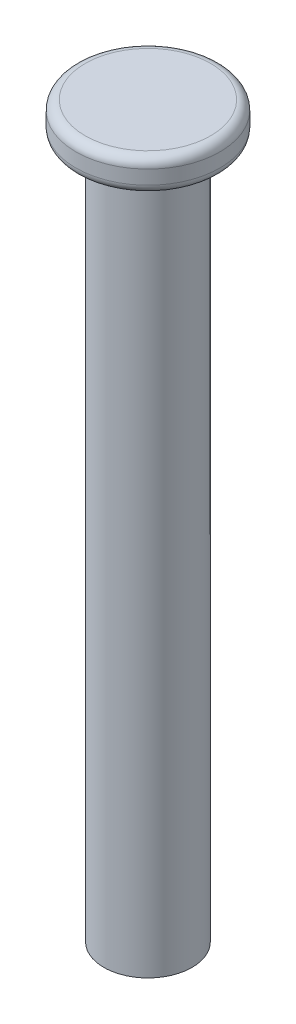
ISO-10303-21;
HEADER;
FILE_DESCRIPTION(('STEP AP214'),'2;1');
FILE_NAME('part.step','',(''),(''),'','','');
FILE_SCHEMA(('AUTOMOTIVE_DESIGN { 1 0 10303 214 1 1 1 1 }'));
ENDSEC;
DATA;
#1=APPLICATION_CONTEXT('core data for automotive mechanical design processes');
#2=APPLICATION_PROTOCOL_DEFINITION('international standard','automotive_design',2000,#1);
#3=PRODUCT_CONTEXT('',#1,'mechanical');
#4=PRODUCT('Part','Part','',(#3));
#5=PRODUCT_RELATED_PRODUCT_CATEGORY('part','',(#4));
#6=PRODUCT_DEFINITION_FORMATION('','',#4);
#7=PRODUCT_DEFINITION_CONTEXT('part definition',#1,'design');
#8=PRODUCT_DEFINITION('design','',#6,#7);
#9=PRODUCT_DEFINITION_SHAPE('','',#8);
#10=(LENGTH_UNIT() NAMED_UNIT(*) SI_UNIT(.MILLI.,.METRE.));
#11=(NAMED_UNIT(*) PLANE_ANGLE_UNIT() SI_UNIT($,.RADIAN.));
#12=(NAMED_UNIT(*) SI_UNIT($,.STERADIAN.) SOLID_ANGLE_UNIT());
#13=UNCERTAINTY_MEASURE_WITH_UNIT(LENGTH_MEASURE(1.E-05),#10,'distance_accuracy_value','');
#14=(GEOMETRIC_REPRESENTATION_CONTEXT(3) GLOBAL_UNCERTAINTY_ASSIGNED_CONTEXT((#13)) GLOBAL_UNIT_ASSIGNED_CONTEXT((#10,
#11,#12)) REPRESENTATION_CONTEXT('',''));
#15=CARTESIAN_POINT('',(0.,0.,0.));
#16=DIRECTION('',(0.,0.,1.));
#17=DIRECTION('',(1.,0.,0.));
#18=AXIS2_PLACEMENT_3D('',#15,#16,#17);
#19=CARTESIAN_POINT('',(0.,19.05,0.));
#20=DIRECTION('',(0.,-1.,0.));
#21=DIRECTION('',(0.,0.,-1.));
#22=AXIS2_PLACEMENT_3D('',#19,#20,#21);
#23=CYLINDRICAL_SURFACE('',#22,1.2065);
#24=CARTESIAN_POINT('',(0.,19.05,0.));
#25=DIRECTION('',(0.,1.,0.));
#26=DIRECTION('',(0.,0.,1.));
#27=AXIS2_PLACEMENT_3D('',#24,#25,#26);
#28=CIRCLE('',#27,1.2065);
#29=CARTESIAN_POINT('',(0.,19.05,-1.2065));
#30=VERTEX_POINT('',#29);
#31=EDGE_CURVE('E50',#30,#30,#28,.T.);
#32=CARTESIAN_POINT('',(0.,0.,0.));
#33=DIRECTION('',(0.,1.,0.));
#34=DIRECTION('',(0.,0.,1.));
#35=AXIS2_PLACEMENT_3D('',#32,#33,#34);
#36=CIRCLE('',#35,1.2065);
#37=CARTESIAN_POINT('',(0.,0.,-1.2065));
#38=VERTEX_POINT('',#37);
#39=EDGE_CURVE('E51',#38,#38,#36,.T.);
#40=CARTESIAN_POINT('',(0.,19.05,-1.2065));
#41=CARTESIAN_POINT('',(0.,18.8515625,-1.2065));
#42=CARTESIAN_POINT('',(0.,18.653125,-1.2065));
#43=CARTESIAN_POINT('',(0.,18.25625,-1.2065));
#44=CARTESIAN_POINT('',(0.,18.0578125,-1.2065));
#45=CARTESIAN_POINT('',(0.,17.6609375,-1.2065));
#46=CARTESIAN_POINT('',(0.,17.4625,-1.2065));
#47=CARTESIAN_POINT('',(0.,17.065625,-1.2065));
#48=CARTESIAN_POINT('',(0.,16.8671875,-1.2065));
#49=CARTESIAN_POINT('',(0.,16.4703125,-1.2065));
#50=CARTESIAN_POINT('',(0.,16.271875,-1.2065));
#51=CARTESIAN_POINT('',(0.,15.875,-1.2065));
#52=CARTESIAN_POINT('',(0.,15.6765625,-1.2065));
#53=CARTESIAN_POINT('',(0.,15.2796875,-1.2065));
#54=CARTESIAN_POINT('',(0.,15.08125,-1.2065));
#55=CARTESIAN_POINT('',(0.,14.684375,-1.2065));
#56=CARTESIAN_POINT('',(0.,14.4859375,-1.2065));
#57=CARTESIAN_POINT('',(0.,14.0890625,-1.2065));
#58=CARTESIAN_POINT('',(0.,13.890625,-1.2065));
#59=CARTESIAN_POINT('',(0.,13.49375,-1.2065));
#60=CARTESIAN_POINT('',(0.,13.2953125,-1.2065));
#61=CARTESIAN_POINT('',(0.,12.8984375,-1.2065));
#62=CARTESIAN_POINT('',(0.,12.7,-1.2065));
#63=CARTESIAN_POINT('',(0.,12.303125,-1.2065));
#64=CARTESIAN_POINT('',(0.,12.1046875,-1.2065));
#65=CARTESIAN_POINT('',(0.,11.7078125,-1.2065));
#66=CARTESIAN_POINT('',(0.,11.509375,-1.2065));
#67=CARTESIAN_POINT('',(0.,11.1125,-1.2065));
#68=CARTESIAN_POINT('',(0.,10.9140625,-1.2065));
#69=CARTESIAN_POINT('',(0.,10.5171875,-1.2065));
#70=CARTESIAN_POINT('',(0.,10.31875,-1.2065));
#71=CARTESIAN_POINT('',(0.,9.921875,-1.2065));
#72=CARTESIAN_POINT('',(0.,9.7234375,-1.2065));
#73=CARTESIAN_POINT('',(0.,9.3265625,-1.2065));
#74=CARTESIAN_POINT('',(0.,9.128125,-1.2065));
#75=CARTESIAN_POINT('',(0.,8.73125,-1.2065));
#76=CARTESIAN_POINT('',(0.,8.5328125,-1.2065));
#77=CARTESIAN_POINT('',(0.,8.1359375,-1.2065));
#78=CARTESIAN_POINT('',(0.,7.9375,-1.2065));
#79=CARTESIAN_POINT('',(0.,7.540625,-1.2065));
#80=CARTESIAN_POINT('',(0.,7.3421875,-1.2065));
#81=CARTESIAN_POINT('',(0.,6.9453125,-1.2065));
#82=CARTESIAN_POINT('',(0.,6.746875,-1.2065));
#83=CARTESIAN_POINT('',(0.,6.35,-1.2065));
#84=CARTESIAN_POINT('',(0.,6.1515625,-1.2065));
#85=CARTESIAN_POINT('',(0.,5.7546875,-1.2065));
#86=CARTESIAN_POINT('',(0.,5.55625,-1.2065));
#87=CARTESIAN_POINT('',(0.,5.159375,-1.2065));
#88=CARTESIAN_POINT('',(0.,4.9609375,-1.2065));
#89=CARTESIAN_POINT('',(0.,4.5640625,-1.2065));
#90=CARTESIAN_POINT('',(0.,4.365625,-1.2065));
#91=CARTESIAN_POINT('',(0.,3.96875,-1.2065));
#92=CARTESIAN_POINT('',(0.,3.7703125,-1.2065));
#93=CARTESIAN_POINT('',(0.,3.3734375,-1.2065));
#94=CARTESIAN_POINT('',(0.,3.175,-1.2065));
#95=CARTESIAN_POINT('',(0.,2.778125,-1.2065));
#96=CARTESIAN_POINT('',(0.,2.5796875,-1.2065));
#97=CARTESIAN_POINT('',(0.,2.1828125,-1.2065));
#98=CARTESIAN_POINT('',(0.,1.984375,-1.2065));
#99=CARTESIAN_POINT('',(0.,1.5875,-1.2065));
#100=CARTESIAN_POINT('',(0.,1.3890625,-1.2065));
#101=CARTESIAN_POINT('',(0.,0.992187500000001,-1.2065));
#102=CARTESIAN_POINT('',(0.,0.793750000000001,-1.2065));
#103=CARTESIAN_POINT('',(0.,0.396875,-1.2065));
#104=CARTESIAN_POINT('',(0.,0.1984375,-1.2065));
#105=CARTESIAN_POINT('',(0.,0.,-1.2065));
#106=B_SPLINE_CURVE_WITH_KNOTS('',3,(#40,#41,#42,#43,#44,#45,#46,#47,#48,#49,#50,#51,#52,#53,
#54,#55,#56,#57,#58,#59,#60,#61,#62,#63,#64,#65,#66,#67,#68,#69,#70,#71,#72,#73,#74,#75,#76,#77,
#78,#79,#80,#81,#82,#83,#84,#85,#86,#87,#88,#89,#90,#91,#92,#93,#94,#95,#96,#97,#98,#99,#100,
#101,#102,#103,#104,#105),.UNSPECIFIED.,.F.,.F.,(4,2,2,2,2,2,2,2,2,2,2,2,2,2,2,2,2,2,2,2,2,2,2,
2,2,2,2,2,2,2,2,2,4),(0.,0.5953125,1.190625,1.7859375,2.38125,2.9765625,3.571875,4.1671875,
4.7625,5.3578125,5.953125,6.5484375,7.14375,7.7390625,8.334375,8.9296875,9.525,10.1203125,
10.715625,11.3109375,11.90625,12.5015625,13.096875,13.6921875,14.2875,14.8828125,15.478125,
16.0734375,16.66875,17.2640625,17.859375,18.4546875,19.05),.UNSPECIFIED.);
#107=EDGE_CURVE('BSEAM30',#30,#38,#106,.T.);
#108=ORIENTED_EDGE('',*,*,#31,.F.);
#109=ORIENTED_EDGE('',*,*,#39,.T.);
#110=ORIENTED_EDGE('',*,*,#107,.T.);
#111=ORIENTED_EDGE('',*,*,#107,.F.);
#112=EDGE_LOOP('',(#108,#110,#109,#111));
#113=FACE_BOUND('',#112,.T.);
#114=ADVANCED_FACE('F30',(#113),#23,.T.);
#115=CARTESIAN_POINT('',(0.,0.,0.));
#116=DIRECTION('',(0.,1.,0.));
#117=DIRECTION('',(0.,0.,1.));
#118=AXIS2_PLACEMENT_3D('',#115,#116,#117);
#119=PLANE('',#118);
#120=ORIENTED_EDGE('',*,*,#39,.F.);
#121=EDGE_LOOP('',(#120));
#122=FACE_BOUND('',#121,.T.);
#123=ADVANCED_FACE('F61',(#122),#119,.F.);
#124=CARTESIAN_POINT('',(0.,19.05,0.));
#125=DIRECTION('',(0.,1.,0.));
#126=DIRECTION('',(0.,0.,1.));
#127=AXIS2_PLACEMENT_3D('',#124,#125,#126);
#128=PLANE('',#127);
#129=CARTESIAN_POINT('',(0.,19.05,0.));
#130=DIRECTION('',(0.,1.,0.));
#131=DIRECTION('',(0.,0.,1.));
#132=AXIS2_PLACEMENT_3D('',#129,#130,#131);
#133=CIRCLE('',#132,1.7145);
#134=CARTESIAN_POINT('',(0.,19.05,1.7145));
#135=VERTEX_POINT('',#134);
#136=EDGE_CURVE('E37',#135,#135,#133,.F.);
#137=ORIENTED_EDGE('',*,*,#136,.T.);
#138=EDGE_LOOP('',(#137));
#139=FACE_BOUND('',#138,.T.);
#140=ORIENTED_EDGE('',*,*,#31,.T.);
#141=EDGE_LOOP('',(#140));
#142=FACE_BOUND('',#141,.T.);
#143=ADVANCED_FACE('F57',(#139,#142),#128,.F.);
#144=CARTESIAN_POINT('',(0.,19.939,0.));
#145=DIRECTION('',(0.,-1.,0.));
#146=DIRECTION('',(0.,0.,-1.));
#147=AXIS2_PLACEMENT_3D('',#144,#145,#146);
#148=CYLINDRICAL_SURFACE('',#147,1.9685);
#149=CARTESIAN_POINT('',(0.,19.304,0.));
#150=DIRECTION('',(0.,1.,0.));
#151=DIRECTION('',(0.,0.,1.));
#152=AXIS2_PLACEMENT_3D('',#149,#150,#151);
#153=CIRCLE('',#152,1.9685);
#154=CARTESIAN_POINT('',(0.,19.304,1.9685));
#155=VERTEX_POINT('',#154);
#156=EDGE_CURVE('E41',#155,#155,#153,.T.);
#157=ORIENTED_EDGE('',*,*,#156,.T.);
#158=EDGE_LOOP('',(#157));
#159=FACE_BOUND('',#158,.T.);
#160=CARTESIAN_POINT('',(0.,19.685,0.));
#161=DIRECTION('',(0.,1.,0.));
#162=DIRECTION('',(0.,0.,1.));
#163=AXIS2_PLACEMENT_3D('',#160,#161,#162);
#164=CIRCLE('',#163,1.9685);
#165=CARTESIAN_POINT('',(0.,19.685,1.9685));
#166=VERTEX_POINT('',#165);
#167=EDGE_CURVE('E45',#166,#166,#164,.F.);
#168=ORIENTED_EDGE('',*,*,#167,.T.);
#169=EDGE_LOOP('',(#168));
#170=FACE_BOUND('',#169,.T.);
#171=ADVANCED_FACE('F70',(#159,#170),#148,.T.);
#172=CARTESIAN_POINT('',(0.,19.939,0.));
#173=DIRECTION('',(0.,1.,0.));
#174=DIRECTION('',(0.,0.,1.));
#175=AXIS2_PLACEMENT_3D('',#172,#173,#174);
#176=PLANE('',#175);
#177=CARTESIAN_POINT('',(0.,19.939,0.));
#178=DIRECTION('',(0.,1.,0.));
#179=DIRECTION('',(0.,0.,1.));
#180=AXIS2_PLACEMENT_3D('',#177,#178,#179);
#181=CIRCLE('',#180,1.7145);
#182=CARTESIAN_POINT('',(0.,19.939,1.7145));
#183=VERTEX_POINT('',#182);
#184=EDGE_CURVE('E10',#183,#183,#181,.T.);
#185=ORIENTED_EDGE('',*,*,#184,.T.);
#186=EDGE_LOOP('',(#185));
#187=FACE_BOUND('',#186,.T.);
#188=ADVANCED_FACE('F75',(#187),#176,.T.);
#189=CARTESIAN_POINT('',(0.,19.304,0.));
#190=DIRECTION('',(0.,1.,0.));
#191=DIRECTION('',(0.,0.,1.));
#192=AXIS2_PLACEMENT_3D('',#189,#190,#191);
#193=TOROIDAL_SURFACE('',#192,1.7145,0.254);
#194=ORIENTED_EDGE('',*,*,#136,.F.);
#195=EDGE_LOOP('',(#194));
#196=FACE_BOUND('',#195,.T.);
#197=ORIENTED_EDGE('',*,*,#156,.F.);
#198=EDGE_LOOP('',(#197));
#199=FACE_BOUND('',#198,.T.);
#200=ADVANCED_FACE('F73',(#196,#199),#193,.T.);
#201=CARTESIAN_POINT('',(0.,19.685,0.));
#202=DIRECTION('',(0.,1.,0.));
#203=DIRECTION('',(0.,0.,1.));
#204=AXIS2_PLACEMENT_3D('',#201,#202,#203);
#205=TOROIDAL_SURFACE('',#204,1.7145,0.254);
#206=ORIENTED_EDGE('',*,*,#167,.F.);
#207=EDGE_LOOP('',(#206));
#208=FACE_BOUND('',#207,.T.);
#209=ORIENTED_EDGE('',*,*,#184,.F.);
#210=EDGE_LOOP('',(#209));
#211=FACE_BOUND('',#210,.T.);
#212=ADVANCED_FACE('F32',(#208,#211),#205,.T.);
#213=CLOSED_SHELL('',(#114,#123,#143,#171,#188,#200,#212));
#214=MANIFOLD_SOLID_BREP('B2',#213);
#215=ADVANCED_BREP_SHAPE_REPRESENTATION('',(#18,#214),#14);
#216=SHAPE_DEFINITION_REPRESENTATION(#9,#215);
ENDSEC;
END-ISO-10303-21;
